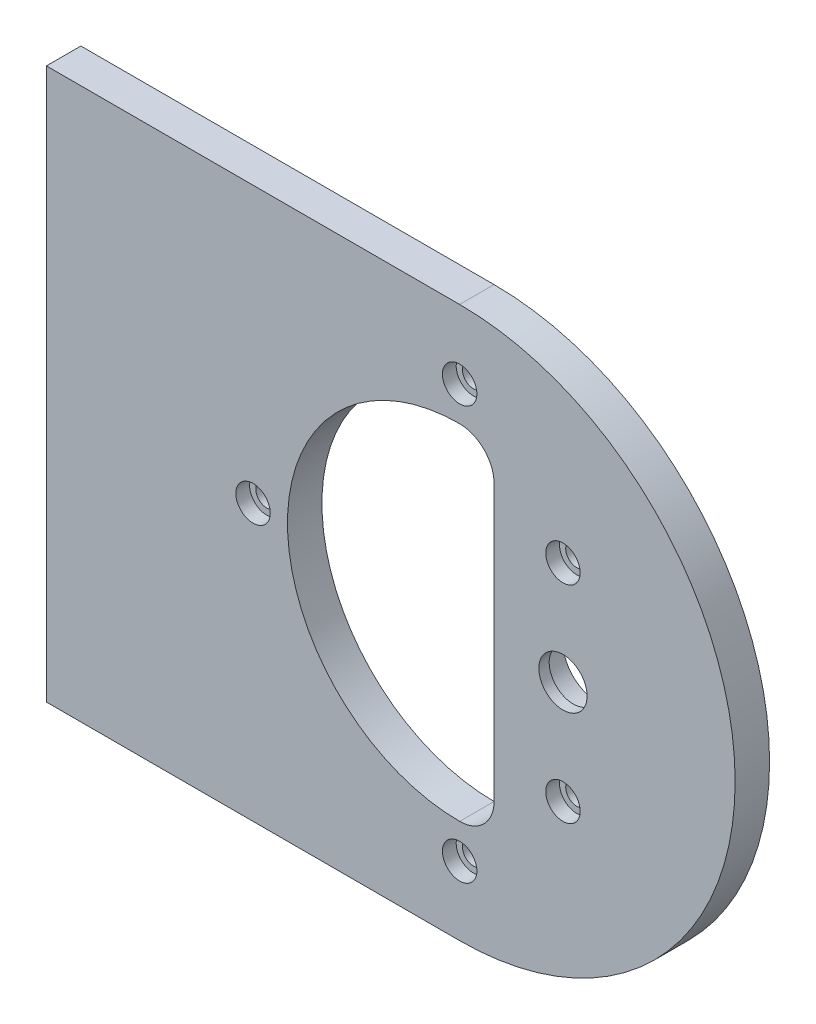
ISO-10303-21;
HEADER;
FILE_DESCRIPTION(('STEP AP214'),'2;1');
FILE_NAME('part.step','',(''),(''),'','','');
FILE_SCHEMA(('AUTOMOTIVE_DESIGN { 1 0 10303 214 1 1 1 1 }'));
ENDSEC;
DATA;
#1=APPLICATION_CONTEXT('core data for automotive mechanical design processes');
#2=APPLICATION_PROTOCOL_DEFINITION('international standard','automotive_design',2000,#1);
#3=PRODUCT_CONTEXT('',#1,'mechanical');
#4=PRODUCT('Part','Part','',(#3));
#5=PRODUCT_RELATED_PRODUCT_CATEGORY('part','',(#4));
#6=PRODUCT_DEFINITION_FORMATION('','',#4);
#7=PRODUCT_DEFINITION_CONTEXT('part definition',#1,'design');
#8=PRODUCT_DEFINITION('design','',#6,#7);
#9=PRODUCT_DEFINITION_SHAPE('','',#8);
#10=(LENGTH_UNIT() NAMED_UNIT(*) SI_UNIT(.MILLI.,.METRE.));
#11=(NAMED_UNIT(*) PLANE_ANGLE_UNIT() SI_UNIT($,.RADIAN.));
#12=(NAMED_UNIT(*) SI_UNIT($,.STERADIAN.) SOLID_ANGLE_UNIT());
#13=UNCERTAINTY_MEASURE_WITH_UNIT(LENGTH_MEASURE(1.E-05),#10,'distance_accuracy_value','');
#14=(GEOMETRIC_REPRESENTATION_CONTEXT(3) GLOBAL_UNCERTAINTY_ASSIGNED_CONTEXT((#13)) GLOBAL_UNIT_ASSIGNED_CONTEXT((#10,
#11,#12)) REPRESENTATION_CONTEXT('',''));
#15=CARTESIAN_POINT('',(0.,0.,0.));
#16=DIRECTION('',(0.,0.,1.));
#17=DIRECTION('',(1.,0.,0.));
#18=AXIS2_PLACEMENT_3D('',#15,#16,#17);
#19=CARTESIAN_POINT('',(6.45751311064591,-9.99999999999998,5.));
#20=DIRECTION('',(0.,1.,0.));
#21=DIRECTION('',(0.,0.,1.));
#22=AXIS2_PLACEMENT_3D('',#19,#20,#21);
#23=PLANE('',#22);
#24=DIRECTION('',(1.,0.,0.));
#25=VECTOR('',#24,1.);
#26=CARTESIAN_POINT('',(6.45751311064591,-9.99999999999998,0.));
#27=LINE('',#26,#25);
#28=CARTESIAN_POINT('',(6.45751311064591,-9.99999999999998,0.));
#29=VERTEX_POINT('',#28);
#30=CARTESIAN_POINT('',(66.4575131106459,-9.99999999999998,0.));
#31=VERTEX_POINT('',#30);
#32=EDGE_CURVE('E143',#29,#31,#27,.T.);
#33=ORIENTED_EDGE('',*,*,#32,.T.);
#34=DIRECTION('',(0.,0.,-1.));
#35=VECTOR('',#34,1.);
#36=CARTESIAN_POINT('',(66.4575131106459,-9.99999999999998,5.));
#37=LINE('',#36,#35);
#38=CARTESIAN_POINT('',(66.4575131106459,-9.99999999999998,5.));
#39=VERTEX_POINT('',#38);
#40=EDGE_CURVE('E11',#39,#31,#37,.T.);
#41=ORIENTED_EDGE('',*,*,#40,.F.);
#42=DIRECTION('',(1.,0.,0.));
#43=VECTOR('',#42,1.);
#44=CARTESIAN_POINT('',(6.45751311064591,-9.99999999999998,5.));
#45=LINE('',#44,#43);
#46=CARTESIAN_POINT('',(6.45751311064591,-9.99999999999998,5.));
#47=VERTEX_POINT('',#46);
#48=EDGE_CURVE('E144',#47,#39,#45,.T.);
#49=ORIENTED_EDGE('',*,*,#48,.F.);
#50=DIRECTION('',(0.,0.,-1.));
#51=VECTOR('',#50,1.);
#52=CARTESIAN_POINT('',(6.45751311064591,-9.99999999999998,5.));
#53=LINE('',#52,#51);
#54=EDGE_CURVE('E154',#47,#29,#53,.T.);
#55=ORIENTED_EDGE('',*,*,#54,.T.);
#56=EDGE_LOOP('',(#33,#41,#49,#55));
#57=FACE_BOUND('',#56,.T.);
#58=ADVANCED_FACE('F35',(#57),#23,.F.);
#59=CARTESIAN_POINT('',(66.4575131106459,30.,5.));
#60=DIRECTION('',(0.,0.,-1.));
#61=DIRECTION('',(-1.,0.,0.));
#62=AXIS2_PLACEMENT_3D('',#59,#60,#61);
#63=CYLINDRICAL_SURFACE('',#62,40.);
#64=CARTESIAN_POINT('',(66.4575131106459,30.,0.));
#65=DIRECTION('',(0.,0.,1.));
#66=DIRECTION('',(1.,0.,0.));
#67=AXIS2_PLACEMENT_3D('',#64,#65,#66);
#68=CIRCLE('',#67,40.);
#69=CARTESIAN_POINT('',(66.4575131106459,70.,0.));
#70=VERTEX_POINT('',#69);
#71=EDGE_CURVE('E157',#31,#70,#68,.T.);
#72=ORIENTED_EDGE('',*,*,#71,.T.);
#73=DIRECTION('',(0.,0.,-1.));
#74=VECTOR('',#73,1.);
#75=CARTESIAN_POINT('',(66.4575131106459,70.,5.));
#76=LINE('',#75,#74);
#77=CARTESIAN_POINT('',(66.4575131106459,70.,5.));
#78=VERTEX_POINT('',#77);
#79=EDGE_CURVE('E43',#78,#70,#76,.T.);
#80=ORIENTED_EDGE('',*,*,#79,.F.);
#81=CARTESIAN_POINT('',(66.4575131106459,30.,5.));
#82=DIRECTION('',(0.,0.,1.));
#83=DIRECTION('',(1.,0.,0.));
#84=AXIS2_PLACEMENT_3D('',#81,#82,#83);
#85=CIRCLE('',#84,40.);
#86=EDGE_CURVE('E147',#39,#78,#85,.T.);
#87=ORIENTED_EDGE('',*,*,#86,.F.);
#88=ORIENTED_EDGE('',*,*,#40,.T.);
#89=EDGE_LOOP('',(#72,#80,#87,#88));
#90=FACE_BOUND('',#89,.T.);
#91=ADVANCED_FACE('F186',(#90),#63,.T.);
#92=CARTESIAN_POINT('',(66.4575131106459,70.,5.));
#93=DIRECTION('',(0.,-1.,0.));
#94=DIRECTION('',(1.,0.,0.));
#95=AXIS2_PLACEMENT_3D('',#92,#93,#94);
#96=PLANE('',#95);
#97=DIRECTION('',(-1.,0.,0.));
#98=VECTOR('',#97,1.);
#99=CARTESIAN_POINT('',(66.4575131106459,70.,0.));
#100=LINE('',#99,#98);
#101=CARTESIAN_POINT('',(6.45751311064591,70.,0.));
#102=VERTEX_POINT('',#101);
#103=EDGE_CURVE('E159',#70,#102,#100,.T.);
#104=ORIENTED_EDGE('',*,*,#103,.T.);
#105=DIRECTION('',(0.,0.,-1.));
#106=VECTOR('',#105,1.);
#107=CARTESIAN_POINT('',(6.45751311064591,70.,5.));
#108=LINE('',#107,#106);
#109=CARTESIAN_POINT('',(6.45751311064591,70.,5.));
#110=VERTEX_POINT('',#109);
#111=EDGE_CURVE('E164',#110,#102,#108,.T.);
#112=ORIENTED_EDGE('',*,*,#111,.F.);
#113=DIRECTION('',(-1.,0.,0.));
#114=VECTOR('',#113,1.);
#115=CARTESIAN_POINT('',(66.4575131106459,70.,5.));
#116=LINE('',#115,#114);
#117=EDGE_CURVE('E150',#78,#110,#116,.T.);
#118=ORIENTED_EDGE('',*,*,#117,.F.);
#119=ORIENTED_EDGE('',*,*,#79,.T.);
#120=EDGE_LOOP('',(#104,#112,#118,#119));
#121=FACE_BOUND('',#120,.T.);
#122=ADVANCED_FACE('F172',(#121),#96,.F.);
#123=CARTESIAN_POINT('',(6.45751311064591,70.,5.));
#124=DIRECTION('',(1.,0.,0.));
#125=DIRECTION('',(0.,0.,-1.));
#126=AXIS2_PLACEMENT_3D('',#123,#124,#125);
#127=PLANE('',#126);
#128=DIRECTION('',(0.,-1.,0.));
#129=VECTOR('',#128,1.);
#130=CARTESIAN_POINT('',(6.45751311064591,70.,0.));
#131=LINE('',#130,#129);
#132=EDGE_CURVE('E148',#102,#29,#131,.T.);
#133=ORIENTED_EDGE('',*,*,#132,.T.);
#134=ORIENTED_EDGE('',*,*,#54,.F.);
#135=DIRECTION('',(0.,-1.,0.));
#136=VECTOR('',#135,1.);
#137=CARTESIAN_POINT('',(6.45751311064591,70.,5.));
#138=LINE('',#137,#136);
#139=EDGE_CURVE('E152',#110,#47,#138,.T.);
#140=ORIENTED_EDGE('',*,*,#139,.F.);
#141=ORIENTED_EDGE('',*,*,#111,.T.);
#142=EDGE_LOOP('',(#133,#134,#140,#141));
#143=FACE_BOUND('',#142,.T.);
#144=ADVANCED_FACE('F179',(#143),#127,.F.);
#145=CARTESIAN_POINT('',(66.4575131106459,30.,5.));
#146=DIRECTION('',(0.,0.,1.));
#147=DIRECTION('',(1.,0.,0.));
#148=AXIS2_PLACEMENT_3D('',#145,#146,#147);
#149=PLANE('',#148);
#150=CARTESIAN_POINT('',(81.4575131106459,30.,5.));
#151=DIRECTION('',(0.,0.,1.));
#152=DIRECTION('',(1.,0.,0.));
#153=AXIS2_PLACEMENT_3D('',#150,#151,#152);
#154=CIRCLE('',#153,3.50000000000001);
#155=CARTESIAN_POINT('',(84.9575131106459,30.,5.));
#156=VERTEX_POINT('',#155);
#157=EDGE_CURVE('E353',#156,#156,#154,.T.);
#158=ORIENTED_EDGE('',*,*,#157,.F.);
#159=EDGE_LOOP('',(#158));
#160=FACE_BOUND('',#159,.T.);
#161=CARTESIAN_POINT('',(66.4575131106465,0.,5.));
#162=DIRECTION('',(0.,0.,1.));
#163=DIRECTION('',(1.,0.,0.));
#164=AXIS2_PLACEMENT_3D('',#161,#162,#163);
#165=CIRCLE('',#164,2.50000000000001);
#166=CARTESIAN_POINT('',(68.9575131106465,0.,5.));
#167=VERTEX_POINT('',#166);
#168=EDGE_CURVE('E393',#167,#167,#165,.T.);
#169=ORIENTED_EDGE('',*,*,#168,.F.);
#170=EDGE_LOOP('',(#169));
#171=FACE_BOUND('',#170,.T.);
#172=CARTESIAN_POINT('',(36.4575131106463,29.9999999999999,5.));
#173=DIRECTION('',(0.,0.,1.));
#174=DIRECTION('',(1.,0.,0.));
#175=AXIS2_PLACEMENT_3D('',#172,#173,#174);
#176=CIRCLE('',#175,2.5);
#177=CARTESIAN_POINT('',(38.9575131106463,29.9999999999999,5.));
#178=VERTEX_POINT('',#177);
#179=EDGE_CURVE('E399',#178,#178,#176,.T.);
#180=ORIENTED_EDGE('',*,*,#179,.F.);
#181=EDGE_LOOP('',(#180));
#182=FACE_BOUND('',#181,.T.);
#183=CARTESIAN_POINT('',(81.4575131106459,45.,5.));
#184=DIRECTION('',(0.,0.,1.));
#185=DIRECTION('',(1.,0.,0.));
#186=AXIS2_PLACEMENT_3D('',#183,#184,#185);
#187=CIRCLE('',#186,2.50000000000001);
#188=CARTESIAN_POINT('',(83.9575131106459,45.,5.));
#189=VERTEX_POINT('',#188);
#190=EDGE_CURVE('E405',#189,#189,#187,.T.);
#191=ORIENTED_EDGE('',*,*,#190,.F.);
#192=EDGE_LOOP('',(#191));
#193=FACE_BOUND('',#192,.T.);
#194=CARTESIAN_POINT('',(81.4575131106459,15.,5.));
#195=DIRECTION('',(0.,0.,1.));
#196=DIRECTION('',(1.,0.,0.));
#197=AXIS2_PLACEMENT_3D('',#194,#195,#196);
#198=CIRCLE('',#197,2.50000000000001);
#199=CARTESIAN_POINT('',(83.9575131106459,15.,5.));
#200=VERTEX_POINT('',#199);
#201=EDGE_CURVE('E386',#200,#200,#198,.T.);
#202=ORIENTED_EDGE('',*,*,#201,.F.);
#203=EDGE_LOOP('',(#202));
#204=FACE_BOUND('',#203,.T.);
#205=CARTESIAN_POINT('',(66.4575131106459,60.,5.));
#206=DIRECTION('',(0.,0.,1.));
#207=DIRECTION('',(1.,0.,0.));
#208=AXIS2_PLACEMENT_3D('',#205,#206,#207);
#209=CIRCLE('',#208,2.50000000000001);
#210=CARTESIAN_POINT('',(68.9575131106459,60.,5.));
#211=VERTEX_POINT('',#210);
#212=EDGE_CURVE('E392',#211,#211,#209,.T.);
#213=ORIENTED_EDGE('',*,*,#212,.F.);
#214=EDGE_LOOP('',(#213));
#215=FACE_BOUND('',#214,.T.);
#216=CARTESIAN_POINT('',(66.4575131106459,10.,5.));
#217=DIRECTION('',(0.,0.,1.));
#218=DIRECTION('',(1.,0.,0.));
#219=AXIS2_PLACEMENT_3D('',#216,#217,#218);
#220=CIRCLE('',#219,5.);
#221=CARTESIAN_POINT('',(71.4575131106459,10.,5.));
#222=VERTEX_POINT('',#221);
#223=CARTESIAN_POINT('',(66.4575131106459,4.99999999999999,5.));
#224=VERTEX_POINT('',#223);
#225=EDGE_CURVE('E140',#222,#224,#220,.F.);
#226=ORIENTED_EDGE('',*,*,#225,.T.);
#227=CARTESIAN_POINT('',(66.4575131106459,30.,5.));
#228=DIRECTION('',(0.,0.,1.));
#229=DIRECTION('',(1.,0.,0.));
#230=AXIS2_PLACEMENT_3D('',#227,#228,#229);
#231=CIRCLE('',#230,25.);
#232=CARTESIAN_POINT('',(66.4575131106459,55.,5.));
#233=VERTEX_POINT('',#232);
#234=EDGE_CURVE('E103',#224,#233,#231,.F.);
#235=ORIENTED_EDGE('',*,*,#234,.T.);
#236=CARTESIAN_POINT('',(66.4575131106459,50.,5.));
#237=DIRECTION('',(0.,0.,1.));
#238=DIRECTION('',(1.,0.,0.));
#239=AXIS2_PLACEMENT_3D('',#236,#237,#238);
#240=CIRCLE('',#239,5.);
#241=CARTESIAN_POINT('',(71.4575131106459,50.,5.));
#242=VERTEX_POINT('',#241);
#243=EDGE_CURVE('E106',#233,#242,#240,.F.);
#244=ORIENTED_EDGE('',*,*,#243,.T.);
#245=DIRECTION('',(0.,-1.,0.));
#246=VECTOR('',#245,1.);
#247=CARTESIAN_POINT('',(71.4575131106459,30.,5.));
#248=LINE('',#247,#246);
#249=EDGE_CURVE('E137',#242,#222,#248,.T.);
#250=ORIENTED_EDGE('',*,*,#249,.T.);
#251=EDGE_LOOP('',(#226,#235,#244,#250));
#252=FACE_BOUND('',#251,.T.);
#253=ORIENTED_EDGE('',*,*,#48,.T.);
#254=ORIENTED_EDGE('',*,*,#86,.T.);
#255=ORIENTED_EDGE('',*,*,#117,.T.);
#256=ORIENTED_EDGE('',*,*,#139,.T.);
#257=EDGE_LOOP('',(#253,#254,#255,#256));
#258=FACE_BOUND('',#257,.T.);
#259=ADVANCED_FACE('F185',(#160,#171,#182,#193,#204,#215,#252,#258),#149,.T.);
#260=CARTESIAN_POINT('',(66.4575131106459,30.,0.));
#261=DIRECTION('',(0.,0.,1.));
#262=DIRECTION('',(1.,0.,0.));
#263=AXIS2_PLACEMENT_3D('',#260,#261,#262);
#264=PLANE('',#263);
#265=CARTESIAN_POINT('',(81.4575131106459,45.,0.));
#266=DIRECTION('',(0.,0.,1.));
#267=DIRECTION('',(1.,0.,0.));
#268=AXIS2_PLACEMENT_3D('',#265,#266,#267);
#269=CIRCLE('',#268,1.60000000000001);
#270=CARTESIAN_POINT('',(83.0575131106459,45.,0.));
#271=VERTEX_POINT('',#270);
#272=EDGE_CURVE('E366',#271,#271,#269,.T.);
#273=ORIENTED_EDGE('',*,*,#272,.T.);
#274=EDGE_LOOP('',(#273));
#275=FACE_BOUND('',#274,.T.);
#276=CARTESIAN_POINT('',(81.4575131106459,15.,0.));
#277=DIRECTION('',(0.,0.,1.));
#278=DIRECTION('',(1.,0.,0.));
#279=AXIS2_PLACEMENT_3D('',#276,#277,#278);
#280=CIRCLE('',#279,1.6);
#281=CARTESIAN_POINT('',(83.0575131106459,15.,0.));
#282=VERTEX_POINT('',#281);
#283=EDGE_CURVE('E372',#282,#282,#280,.T.);
#284=ORIENTED_EDGE('',*,*,#283,.T.);
#285=EDGE_LOOP('',(#284));
#286=FACE_BOUND('',#285,.T.);
#287=CARTESIAN_POINT('',(66.4575131106465,0.,0.));
#288=DIRECTION('',(0.,0.,1.));
#289=DIRECTION('',(1.,0.,0.));
#290=AXIS2_PLACEMENT_3D('',#287,#288,#289);
#291=CIRCLE('',#290,1.60000000000001);
#292=CARTESIAN_POINT('',(68.0575131106466,0.,0.));
#293=VERTEX_POINT('',#292);
#294=EDGE_CURVE('E378',#293,#293,#291,.T.);
#295=ORIENTED_EDGE('',*,*,#294,.T.);
#296=EDGE_LOOP('',(#295));
#297=FACE_BOUND('',#296,.T.);
#298=CARTESIAN_POINT('',(36.4575131106463,29.9999999999999,0.));
#299=DIRECTION('',(0.,0.,1.));
#300=DIRECTION('',(1.,0.,0.));
#301=AXIS2_PLACEMENT_3D('',#298,#299,#300);
#302=CIRCLE('',#301,1.6);
#303=CARTESIAN_POINT('',(38.0575131106463,29.9999999999999,0.));
#304=VERTEX_POINT('',#303);
#305=EDGE_CURVE('E356',#304,#304,#302,.T.);
#306=ORIENTED_EDGE('',*,*,#305,.T.);
#307=EDGE_LOOP('',(#306));
#308=FACE_BOUND('',#307,.T.);
#309=CARTESIAN_POINT('',(66.4575131106459,60.,0.));
#310=DIRECTION('',(0.,0.,1.));
#311=DIRECTION('',(1.,0.,0.));
#312=AXIS2_PLACEMENT_3D('',#309,#310,#311);
#313=CIRCLE('',#312,1.60000000000001);
#314=CARTESIAN_POINT('',(68.0575131106459,60.,0.));
#315=VERTEX_POINT('',#314);
#316=EDGE_CURVE('E365',#315,#315,#313,.T.);
#317=ORIENTED_EDGE('',*,*,#316,.T.);
#318=EDGE_LOOP('',(#317));
#319=FACE_BOUND('',#318,.T.);
#320=CARTESIAN_POINT('',(92.974017405142,56.5165042944966,0.));
#321=DIRECTION('',(0.,0.,1.));
#322=DIRECTION('',(1.,0.,0.));
#323=AXIS2_PLACEMENT_3D('',#320,#321,#322);
#324=CIRCLE('',#323,0.999999999999998);
#325=CARTESIAN_POINT('',(93.974017405142,56.5165042944966,0.));
#326=VERTEX_POINT('',#325);
#327=EDGE_CURVE('E423',#326,#326,#324,.T.);
#328=ORIENTED_EDGE('',*,*,#327,.T.);
#329=EDGE_LOOP('',(#328));
#330=FACE_BOUND('',#329,.T.);
#331=CARTESIAN_POINT('',(103.957513110647,30.0000000000015,0.));
#332=DIRECTION('',(0.,0.,1.));
#333=DIRECTION('',(1.,0.,0.));
#334=AXIS2_PLACEMENT_3D('',#331,#332,#333);
#335=CIRCLE('',#334,0.999999999999998);
#336=CARTESIAN_POINT('',(104.957513110647,30.0000000000015,0.));
#337=VERTEX_POINT('',#336);
#338=EDGE_CURVE('E429',#337,#337,#335,.T.);
#339=ORIENTED_EDGE('',*,*,#338,.T.);
#340=EDGE_LOOP('',(#339));
#341=FACE_BOUND('',#340,.T.);
#342=CARTESIAN_POINT('',(92.974017405144,3.48349570550546,0.));
#343=DIRECTION('',(0.,0.,1.));
#344=DIRECTION('',(1.,0.,0.));
#345=AXIS2_PLACEMENT_3D('',#342,#343,#344);
#346=CIRCLE('',#345,1.);
#347=CARTESIAN_POINT('',(93.974017405144,3.48349570550546,0.));
#348=VERTEX_POINT('',#347);
#349=EDGE_CURVE('E435',#348,#348,#346,.T.);
#350=ORIENTED_EDGE('',*,*,#349,.T.);
#351=EDGE_LOOP('',(#350));
#352=FACE_BOUND('',#351,.T.);
#353=CARTESIAN_POINT('',(66.4575131106488,-7.50000000000003,0.));
#354=DIRECTION('',(0.,0.,1.));
#355=DIRECTION('',(1.,0.,0.));
#356=AXIS2_PLACEMENT_3D('',#353,#354,#355);
#357=CIRCLE('',#356,0.999999999999994);
#358=CARTESIAN_POINT('',(67.4575131106488,-7.50000000000003,0.));
#359=VERTEX_POINT('',#358);
#360=EDGE_CURVE('E441',#359,#359,#357,.T.);
#361=ORIENTED_EDGE('',*,*,#360,.T.);
#362=EDGE_LOOP('',(#361));
#363=FACE_BOUND('',#362,.T.);
#364=CARTESIAN_POINT('',(39.9410088161529,3.48349570550356,0.));
#365=DIRECTION('',(0.,0.,1.));
#366=DIRECTION('',(1.,0.,0.));
#367=AXIS2_PLACEMENT_3D('',#364,#365,#366);
#368=CIRCLE('',#367,0.999999999999998);
#369=CARTESIAN_POINT('',(40.9410088161529,3.48349570550356,0.));
#370=VERTEX_POINT('',#369);
#371=EDGE_CURVE('E447',#370,#370,#368,.T.);
#372=ORIENTED_EDGE('',*,*,#371,.T.);
#373=EDGE_LOOP('',(#372));
#374=FACE_BOUND('',#373,.T.);
#375=CARTESIAN_POINT('',(28.9575131106475,29.9999999999988,0.));
#376=DIRECTION('',(0.,0.,1.));
#377=DIRECTION('',(1.,0.,0.));
#378=AXIS2_PLACEMENT_3D('',#375,#376,#377);
#379=CIRCLE('',#378,0.999999999999994);
#380=CARTESIAN_POINT('',(29.9575131106475,29.9999999999988,0.));
#381=VERTEX_POINT('',#380);
#382=EDGE_CURVE('E453',#381,#381,#379,.T.);
#383=ORIENTED_EDGE('',*,*,#382,.T.);
#384=EDGE_LOOP('',(#383));
#385=FACE_BOUND('',#384,.T.);
#386=CARTESIAN_POINT('',(39.9410088161512,56.5165042944947,0.));
#387=DIRECTION('',(0.,0.,1.));
#388=DIRECTION('',(1.,0.,0.));
#389=AXIS2_PLACEMENT_3D('',#386,#387,#388);
#390=CIRCLE('',#389,1.);
#391=CARTESIAN_POINT('',(40.9410088161512,56.5165042944947,0.));
#392=VERTEX_POINT('',#391);
#393=EDGE_CURVE('E416',#392,#392,#390,.T.);
#394=ORIENTED_EDGE('',*,*,#393,.T.);
#395=EDGE_LOOP('',(#394));
#396=FACE_BOUND('',#395,.T.);
#397=CARTESIAN_POINT('',(66.4575131106459,67.5,0.));
#398=DIRECTION('',(0.,0.,1.));
#399=DIRECTION('',(1.,0.,0.));
#400=AXIS2_PLACEMENT_3D('',#397,#398,#399);
#401=CIRCLE('',#400,0.999999999999998);
#402=CARTESIAN_POINT('',(67.4575131106459,67.5,0.));
#403=VERTEX_POINT('',#402);
#404=EDGE_CURVE('E422',#403,#403,#401,.T.);
#405=ORIENTED_EDGE('',*,*,#404,.T.);
#406=EDGE_LOOP('',(#405));
#407=FACE_BOUND('',#406,.T.);
#408=CARTESIAN_POINT('',(81.4575131106459,30.,0.));
#409=DIRECTION('',(0.,0.,1.));
#410=DIRECTION('',(1.,0.,0.));
#411=AXIS2_PLACEMENT_3D('',#408,#409,#410);
#412=CIRCLE('',#411,5.00000000000001);
#413=CARTESIAN_POINT('',(86.4575131106459,30.,0.));
#414=VERTEX_POINT('',#413);
#415=EDGE_CURVE('E125',#414,#414,#412,.T.);
#416=ORIENTED_EDGE('',*,*,#415,.T.);
#417=EDGE_LOOP('',(#416));
#418=FACE_BOUND('',#417,.T.);
#419=CARTESIAN_POINT('',(66.4575131106459,30.,0.));
#420=DIRECTION('',(0.,0.,1.));
#421=DIRECTION('',(1.,0.,0.));
#422=AXIS2_PLACEMENT_3D('',#419,#420,#421);
#423=CIRCLE('',#422,25.);
#424=CARTESIAN_POINT('',(66.4575131106459,55.,0.));
#425=VERTEX_POINT('',#424);
#426=CARTESIAN_POINT('',(66.4575131106459,4.99999999999999,0.));
#427=VERTEX_POINT('',#426);
#428=EDGE_CURVE('E58',#425,#427,#423,.T.);
#429=ORIENTED_EDGE('',*,*,#428,.T.);
#430=CARTESIAN_POINT('',(66.4575131106459,10.,0.));
#431=DIRECTION('',(0.,0.,1.));
#432=DIRECTION('',(1.,0.,0.));
#433=AXIS2_PLACEMENT_3D('',#430,#431,#432);
#434=CIRCLE('',#433,5.);
#435=CARTESIAN_POINT('',(71.4575131106459,10.,0.));
#436=VERTEX_POINT('',#435);
#437=EDGE_CURVE('E110',#427,#436,#434,.T.);
#438=ORIENTED_EDGE('',*,*,#437,.T.);
#439=DIRECTION('',(0.,1.,0.));
#440=VECTOR('',#439,1.);
#441=CARTESIAN_POINT('',(71.4575131106459,35.,0.));
#442=LINE('',#441,#440);
#443=CARTESIAN_POINT('',(71.4575131106459,50.,0.));
#444=VERTEX_POINT('',#443);
#445=EDGE_CURVE('E116',#436,#444,#442,.T.);
#446=ORIENTED_EDGE('',*,*,#445,.T.);
#447=CARTESIAN_POINT('',(66.4575131106459,50.,0.));
#448=DIRECTION('',(0.,0.,1.));
#449=DIRECTION('',(1.,0.,0.));
#450=AXIS2_PLACEMENT_3D('',#447,#448,#449);
#451=CIRCLE('',#450,5.);
#452=EDGE_CURVE('E121',#444,#425,#451,.T.);
#453=ORIENTED_EDGE('',*,*,#452,.T.);
#454=EDGE_LOOP('',(#429,#438,#446,#453));
#455=FACE_BOUND('',#454,.T.);
#456=ORIENTED_EDGE('',*,*,#32,.F.);
#457=ORIENTED_EDGE('',*,*,#132,.F.);
#458=ORIENTED_EDGE('',*,*,#103,.F.);
#459=ORIENTED_EDGE('',*,*,#71,.F.);
#460=EDGE_LOOP('',(#456,#457,#458,#459));
#461=FACE_BOUND('',#460,.T.);
#462=ADVANCED_FACE('F119',(#275,#286,#297,#308,#319,#330,#341,#352,#363,#374,#385,#396,#407,
#418,#455,#461),#264,.F.);
#463=CARTESIAN_POINT('',(66.4575131106459,30.,10.));
#464=DIRECTION('',(0.,0.,-1.));
#465=DIRECTION('',(-1.,0.,0.));
#466=AXIS2_PLACEMENT_3D('',#463,#464,#465);
#467=CYLINDRICAL_SURFACE('',#466,25.);
#468=DIRECTION('',(0.,0.,-1.));
#469=VECTOR('',#468,1.);
#470=CARTESIAN_POINT('',(66.4575131106459,4.99999999999999,10.));
#471=LINE('',#470,#469);
#472=EDGE_CURVE('E99',#224,#427,#471,.T.);
#473=ORIENTED_EDGE('',*,*,#472,.T.);
#474=ORIENTED_EDGE('',*,*,#428,.F.);
#475=DIRECTION('',(0.,0.,-1.));
#476=VECTOR('',#475,1.);
#477=CARTESIAN_POINT('',(66.4575131106459,55.,10.));
#478=LINE('',#477,#476);
#479=EDGE_CURVE('E131',#233,#425,#478,.T.);
#480=ORIENTED_EDGE('',*,*,#479,.F.);
#481=ORIENTED_EDGE('',*,*,#234,.F.);
#482=EDGE_LOOP('',(#473,#474,#480,#481));
#483=FACE_BOUND('',#482,.T.);
#484=ADVANCED_FACE('F101',(#483),#467,.F.);
#485=CARTESIAN_POINT('',(66.4575131106459,10.,10.));
#486=DIRECTION('',(0.,0.,-1.));
#487=DIRECTION('',(-1.,0.,0.));
#488=AXIS2_PLACEMENT_3D('',#485,#486,#487);
#489=CYLINDRICAL_SURFACE('',#488,5.);
#490=DIRECTION('',(0.,0.,-1.));
#491=VECTOR('',#490,1.);
#492=CARTESIAN_POINT('',(71.4575131106459,10.,10.));
#493=LINE('',#492,#491);
#494=EDGE_CURVE('E107',#222,#436,#493,.T.);
#495=ORIENTED_EDGE('',*,*,#494,.T.);
#496=ORIENTED_EDGE('',*,*,#437,.F.);
#497=ORIENTED_EDGE('',*,*,#472,.F.);
#498=ORIENTED_EDGE('',*,*,#225,.F.);
#499=EDGE_LOOP('',(#495,#496,#497,#498));
#500=FACE_BOUND('',#499,.T.);
#501=ADVANCED_FACE('F111',(#500),#489,.F.);
#502=CARTESIAN_POINT('',(71.4575131106459,35.,10.));
#503=DIRECTION('',(-1.,0.,0.));
#504=DIRECTION('',(0.,0.,1.));
#505=AXIS2_PLACEMENT_3D('',#502,#503,#504);
#506=PLANE('',#505);
#507=DIRECTION('',(0.,0.,-1.));
#508=VECTOR('',#507,1.);
#509=CARTESIAN_POINT('',(71.4575131106459,50.,10.));
#510=LINE('',#509,#508);
#511=EDGE_CURVE('E50',#242,#444,#510,.T.);
#512=ORIENTED_EDGE('',*,*,#511,.T.);
#513=ORIENTED_EDGE('',*,*,#445,.F.);
#514=ORIENTED_EDGE('',*,*,#494,.F.);
#515=ORIENTED_EDGE('',*,*,#249,.F.);
#516=EDGE_LOOP('',(#512,#513,#514,#515));
#517=FACE_BOUND('',#516,.T.);
#518=ADVANCED_FACE('F206',(#517),#506,.T.);
#519=CARTESIAN_POINT('',(66.4575131106459,50.,10.));
#520=DIRECTION('',(0.,0.,-1.));
#521=DIRECTION('',(-1.,0.,0.));
#522=AXIS2_PLACEMENT_3D('',#519,#520,#521);
#523=CYLINDRICAL_SURFACE('',#522,5.);
#524=ORIENTED_EDGE('',*,*,#479,.T.);
#525=ORIENTED_EDGE('',*,*,#452,.F.);
#526=ORIENTED_EDGE('',*,*,#511,.F.);
#527=ORIENTED_EDGE('',*,*,#243,.F.);
#528=EDGE_LOOP('',(#524,#525,#526,#527));
#529=FACE_BOUND('',#528,.T.);
#530=ADVANCED_FACE('F209',(#529),#523,.F.);
#531=CARTESIAN_POINT('',(81.4575131106459,30.,3.5));
#532=DIRECTION('',(0.,0.,-1.));
#533=DIRECTION('',(-1.,0.,0.));
#534=AXIS2_PLACEMENT_3D('',#531,#532,#533);
#535=CYLINDRICAL_SURFACE('',#534,5.00000000000001);
#536=CARTESIAN_POINT('',(81.4575131106459,30.,3.5));
#537=DIRECTION('',(0.,0.,1.));
#538=DIRECTION('',(1.,0.,0.));
#539=AXIS2_PLACEMENT_3D('',#536,#537,#538);
#540=CIRCLE('',#539,5.00000000000001);
#541=CARTESIAN_POINT('',(86.4575131106459,30.,3.5));
#542=VERTEX_POINT('',#541);
#543=EDGE_CURVE('E122',#542,#542,#540,.T.);
#544=ORIENTED_EDGE('',*,*,#543,.T.);
#545=EDGE_LOOP('',(#544));
#546=FACE_BOUND('',#545,.T.);
#547=ORIENTED_EDGE('',*,*,#415,.F.);
#548=EDGE_LOOP('',(#547));
#549=FACE_BOUND('',#548,.T.);
#550=ADVANCED_FACE('F213',(#546,#549),#535,.F.);
#551=CARTESIAN_POINT('',(81.4575131106459,30.,3.5));
#552=DIRECTION('',(0.,0.,1.));
#553=DIRECTION('',(1.,0.,0.));
#554=AXIS2_PLACEMENT_3D('',#551,#552,#553);
#555=PLANE('',#554);
#556=CARTESIAN_POINT('',(81.4575131106459,30.,3.5));
#557=DIRECTION('',(0.,0.,1.));
#558=DIRECTION('',(1.,0.,0.));
#559=AXIS2_PLACEMENT_3D('',#556,#557,#558);
#560=CIRCLE('',#559,3.50000000000001);
#561=CARTESIAN_POINT('',(84.9575131106459,30.,3.5));
#562=VERTEX_POINT('',#561);
#563=EDGE_CURVE('E38',#562,#562,#560,.T.);
#564=ORIENTED_EDGE('',*,*,#563,.T.);
#565=EDGE_LOOP('',(#564));
#566=FACE_BOUND('',#565,.T.);
#567=ORIENTED_EDGE('',*,*,#543,.F.);
#568=EDGE_LOOP('',(#567));
#569=FACE_BOUND('',#568,.T.);
#570=ADVANCED_FACE('F216',(#566,#569),#555,.F.);
#571=CARTESIAN_POINT('',(66.4575131106459,67.5,1.));
#572=DIRECTION('',(0.,0.,-1.));
#573=DIRECTION('',(-1.,0.,0.));
#574=AXIS2_PLACEMENT_3D('',#571,#572,#573);
#575=CYLINDRICAL_SURFACE('',#574,0.999999999999998);
#576=CARTESIAN_POINT('',(66.4575131106459,67.5,1.));
#577=DIRECTION('',(0.,0.,1.));
#578=DIRECTION('',(1.,0.,0.));
#579=AXIS2_PLACEMENT_3D('',#576,#577,#578);
#580=CIRCLE('',#579,0.999999999999998);
#581=CARTESIAN_POINT('',(67.4575131106459,67.5,1.));
#582=VERTEX_POINT('',#581);
#583=EDGE_CURVE('E461',#582,#582,#580,.T.);
#584=ORIENTED_EDGE('',*,*,#583,.T.);
#585=EDGE_LOOP('',(#584));
#586=FACE_BOUND('',#585,.T.);
#587=ORIENTED_EDGE('',*,*,#404,.F.);
#588=EDGE_LOOP('',(#587));
#589=FACE_BOUND('',#588,.T.);
#590=ADVANCED_FACE('F220',(#586,#589),#575,.F.);
#591=CARTESIAN_POINT('',(66.4575131106459,67.5,1.));
#592=DIRECTION('',(0.,0.,1.));
#593=DIRECTION('',(1.,0.,0.));
#594=AXIS2_PLACEMENT_3D('',#591,#592,#593);
#595=PLANE('',#594);
#596=ORIENTED_EDGE('',*,*,#583,.F.);
#597=EDGE_LOOP('',(#596));
#598=FACE_BOUND('',#597,.T.);
#599=ADVANCED_FACE('F224',(#598),#595,.F.);
#600=CARTESIAN_POINT('',(39.9410088161512,56.5165042944947,1.));
#601=DIRECTION('',(0.,0.,-1.));
#602=DIRECTION('',(-1.,0.,0.));
#603=AXIS2_PLACEMENT_3D('',#600,#601,#602);
#604=CYLINDRICAL_SURFACE('',#603,1.);
#605=CARTESIAN_POINT('',(39.9410088161512,56.5165042944947,1.));
#606=DIRECTION('',(0.,0.,1.));
#607=DIRECTION('',(1.,0.,0.));
#608=AXIS2_PLACEMENT_3D('',#605,#606,#607);
#609=CIRCLE('',#608,1.);
#610=CARTESIAN_POINT('',(40.9410088161512,56.5165042944947,1.));
#611=VERTEX_POINT('',#610);
#612=EDGE_CURVE('E456',#611,#611,#609,.T.);
#613=ORIENTED_EDGE('',*,*,#612,.T.);
#614=EDGE_LOOP('',(#613));
#615=FACE_BOUND('',#614,.T.);
#616=ORIENTED_EDGE('',*,*,#393,.F.);
#617=EDGE_LOOP('',(#616));
#618=FACE_BOUND('',#617,.T.);
#619=ADVANCED_FACE('F228',(#615,#618),#604,.F.);
#620=CARTESIAN_POINT('',(39.9410088161512,56.5165042944947,1.));
#621=DIRECTION('',(0.,0.,1.));
#622=DIRECTION('',(1.,0.,0.));
#623=AXIS2_PLACEMENT_3D('',#620,#621,#622);
#624=PLANE('',#623);
#625=ORIENTED_EDGE('',*,*,#612,.F.);
#626=EDGE_LOOP('',(#625));
#627=FACE_BOUND('',#626,.T.);
#628=ADVANCED_FACE('F232',(#627),#624,.F.);
#629=CARTESIAN_POINT('',(28.9575131106475,29.9999999999988,1.));
#630=DIRECTION('',(0.,0.,-1.));
#631=DIRECTION('',(-1.,0.,0.));
#632=AXIS2_PLACEMENT_3D('',#629,#630,#631);
#633=CYLINDRICAL_SURFACE('',#632,0.999999999999994);
#634=CARTESIAN_POINT('',(28.9575131106475,29.9999999999988,1.));
#635=DIRECTION('',(0.,0.,1.));
#636=DIRECTION('',(1.,0.,0.));
#637=AXIS2_PLACEMENT_3D('',#634,#635,#636);
#638=CIRCLE('',#637,0.999999999999994);
#639=CARTESIAN_POINT('',(29.9575131106475,29.9999999999988,1.));
#640=VERTEX_POINT('',#639);
#641=EDGE_CURVE('E450',#640,#640,#638,.T.);
#642=ORIENTED_EDGE('',*,*,#641,.T.);
#643=EDGE_LOOP('',(#642));
#644=FACE_BOUND('',#643,.T.);
#645=ORIENTED_EDGE('',*,*,#382,.F.);
#646=EDGE_LOOP('',(#645));
#647=FACE_BOUND('',#646,.T.);
#648=ADVANCED_FACE('F236',(#644,#647),#633,.F.);
#649=CARTESIAN_POINT('',(28.9575131106475,29.9999999999988,1.));
#650=DIRECTION('',(0.,0.,1.));
#651=DIRECTION('',(1.,0.,0.));
#652=AXIS2_PLACEMENT_3D('',#649,#650,#651);
#653=PLANE('',#652);
#654=ORIENTED_EDGE('',*,*,#641,.F.);
#655=EDGE_LOOP('',(#654));
#656=FACE_BOUND('',#655,.T.);
#657=ADVANCED_FACE('F240',(#656),#653,.F.);
#658=CARTESIAN_POINT('',(39.9410088161529,3.48349570550356,1.));
#659=DIRECTION('',(0.,0.,-1.));
#660=DIRECTION('',(-1.,0.,0.));
#661=AXIS2_PLACEMENT_3D('',#658,#659,#660);
#662=CYLINDRICAL_SURFACE('',#661,0.999999999999998);
#663=CARTESIAN_POINT('',(39.9410088161529,3.48349570550356,1.));
#664=DIRECTION('',(0.,0.,1.));
#665=DIRECTION('',(1.,0.,0.));
#666=AXIS2_PLACEMENT_3D('',#663,#664,#665);
#667=CIRCLE('',#666,0.999999999999998);
#668=CARTESIAN_POINT('',(40.9410088161529,3.48349570550356,1.));
#669=VERTEX_POINT('',#668);
#670=EDGE_CURVE('E444',#669,#669,#667,.T.);
#671=ORIENTED_EDGE('',*,*,#670,.T.);
#672=EDGE_LOOP('',(#671));
#673=FACE_BOUND('',#672,.T.);
#674=ORIENTED_EDGE('',*,*,#371,.F.);
#675=EDGE_LOOP('',(#674));
#676=FACE_BOUND('',#675,.T.);
#677=ADVANCED_FACE('F244',(#673,#676),#662,.F.);
#678=CARTESIAN_POINT('',(39.9410088161529,3.48349570550356,1.));
#679=DIRECTION('',(0.,0.,1.));
#680=DIRECTION('',(1.,0.,0.));
#681=AXIS2_PLACEMENT_3D('',#678,#679,#680);
#682=PLANE('',#681);
#683=ORIENTED_EDGE('',*,*,#670,.F.);
#684=EDGE_LOOP('',(#683));
#685=FACE_BOUND('',#684,.T.);
#686=ADVANCED_FACE('F248',(#685),#682,.F.);
#687=CARTESIAN_POINT('',(66.4575131106488,-7.50000000000003,1.));
#688=DIRECTION('',(0.,0.,-1.));
#689=DIRECTION('',(-1.,0.,0.));
#690=AXIS2_PLACEMENT_3D('',#687,#688,#689);
#691=CYLINDRICAL_SURFACE('',#690,0.999999999999994);
#692=CARTESIAN_POINT('',(66.4575131106488,-7.50000000000003,1.));
#693=DIRECTION('',(0.,0.,1.));
#694=DIRECTION('',(1.,0.,0.));
#695=AXIS2_PLACEMENT_3D('',#692,#693,#694);
#696=CIRCLE('',#695,0.999999999999994);
#697=CARTESIAN_POINT('',(67.4575131106488,-7.50000000000003,1.));
#698=VERTEX_POINT('',#697);
#699=EDGE_CURVE('E438',#698,#698,#696,.T.);
#700=ORIENTED_EDGE('',*,*,#699,.T.);
#701=EDGE_LOOP('',(#700));
#702=FACE_BOUND('',#701,.T.);
#703=ORIENTED_EDGE('',*,*,#360,.F.);
#704=EDGE_LOOP('',(#703));
#705=FACE_BOUND('',#704,.T.);
#706=ADVANCED_FACE('F252',(#702,#705),#691,.F.);
#707=CARTESIAN_POINT('',(66.4575131106488,-7.50000000000003,1.));
#708=DIRECTION('',(0.,0.,1.));
#709=DIRECTION('',(1.,0.,0.));
#710=AXIS2_PLACEMENT_3D('',#707,#708,#709);
#711=PLANE('',#710);
#712=ORIENTED_EDGE('',*,*,#699,.F.);
#713=EDGE_LOOP('',(#712));
#714=FACE_BOUND('',#713,.T.);
#715=ADVANCED_FACE('F256',(#714),#711,.F.);
#716=CARTESIAN_POINT('',(92.974017405144,3.48349570550546,1.));
#717=DIRECTION('',(0.,0.,-1.));
#718=DIRECTION('',(-1.,0.,0.));
#719=AXIS2_PLACEMENT_3D('',#716,#717,#718);
#720=CYLINDRICAL_SURFACE('',#719,1.);
#721=CARTESIAN_POINT('',(92.974017405144,3.48349570550546,1.));
#722=DIRECTION('',(0.,0.,1.));
#723=DIRECTION('',(1.,0.,0.));
#724=AXIS2_PLACEMENT_3D('',#721,#722,#723);
#725=CIRCLE('',#724,1.);
#726=CARTESIAN_POINT('',(93.974017405144,3.48349570550546,1.));
#727=VERTEX_POINT('',#726);
#728=EDGE_CURVE('E432',#727,#727,#725,.T.);
#729=ORIENTED_EDGE('',*,*,#728,.T.);
#730=EDGE_LOOP('',(#729));
#731=FACE_BOUND('',#730,.T.);
#732=ORIENTED_EDGE('',*,*,#349,.F.);
#733=EDGE_LOOP('',(#732));
#734=FACE_BOUND('',#733,.T.);
#735=ADVANCED_FACE('F260',(#731,#734),#720,.F.);
#736=CARTESIAN_POINT('',(92.974017405144,3.48349570550546,1.));
#737=DIRECTION('',(0.,0.,1.));
#738=DIRECTION('',(1.,0.,0.));
#739=AXIS2_PLACEMENT_3D('',#736,#737,#738);
#740=PLANE('',#739);
#741=ORIENTED_EDGE('',*,*,#728,.F.);
#742=EDGE_LOOP('',(#741));
#743=FACE_BOUND('',#742,.T.);
#744=ADVANCED_FACE('F264',(#743),#740,.F.);
#745=CARTESIAN_POINT('',(103.957513110647,30.0000000000015,1.));
#746=DIRECTION('',(0.,0.,-1.));
#747=DIRECTION('',(-1.,0.,0.));
#748=AXIS2_PLACEMENT_3D('',#745,#746,#747);
#749=CYLINDRICAL_SURFACE('',#748,0.999999999999998);
#750=CARTESIAN_POINT('',(103.957513110647,30.0000000000015,1.));
#751=DIRECTION('',(0.,0.,1.));
#752=DIRECTION('',(1.,0.,0.));
#753=AXIS2_PLACEMENT_3D('',#750,#751,#752);
#754=CIRCLE('',#753,0.999999999999998);
#755=CARTESIAN_POINT('',(104.957513110647,30.0000000000015,1.));
#756=VERTEX_POINT('',#755);
#757=EDGE_CURVE('E426',#756,#756,#754,.T.);
#758=ORIENTED_EDGE('',*,*,#757,.T.);
#759=EDGE_LOOP('',(#758));
#760=FACE_BOUND('',#759,.T.);
#761=ORIENTED_EDGE('',*,*,#338,.F.);
#762=EDGE_LOOP('',(#761));
#763=FACE_BOUND('',#762,.T.);
#764=ADVANCED_FACE('F268',(#760,#763),#749,.F.);
#765=CARTESIAN_POINT('',(103.957513110647,30.0000000000015,1.));
#766=DIRECTION('',(0.,0.,1.));
#767=DIRECTION('',(1.,0.,0.));
#768=AXIS2_PLACEMENT_3D('',#765,#766,#767);
#769=PLANE('',#768);
#770=ORIENTED_EDGE('',*,*,#757,.F.);
#771=EDGE_LOOP('',(#770));
#772=FACE_BOUND('',#771,.T.);
#773=ADVANCED_FACE('F272',(#772),#769,.F.);
#774=CARTESIAN_POINT('',(92.974017405142,56.5165042944966,1.));
#775=DIRECTION('',(0.,0.,-1.));
#776=DIRECTION('',(-1.,0.,0.));
#777=AXIS2_PLACEMENT_3D('',#774,#775,#776);
#778=CYLINDRICAL_SURFACE('',#777,0.999999999999998);
#779=CARTESIAN_POINT('',(92.974017405142,56.5165042944966,1.));
#780=DIRECTION('',(0.,0.,1.));
#781=DIRECTION('',(1.,0.,0.));
#782=AXIS2_PLACEMENT_3D('',#779,#780,#781);
#783=CIRCLE('',#782,0.999999999999998);
#784=CARTESIAN_POINT('',(93.974017405142,56.5165042944966,1.));
#785=VERTEX_POINT('',#784);
#786=EDGE_CURVE('E419',#785,#785,#783,.T.);
#787=ORIENTED_EDGE('',*,*,#786,.T.);
#788=EDGE_LOOP('',(#787));
#789=FACE_BOUND('',#788,.T.);
#790=ORIENTED_EDGE('',*,*,#327,.F.);
#791=EDGE_LOOP('',(#790));
#792=FACE_BOUND('',#791,.T.);
#793=ADVANCED_FACE('F276',(#789,#792),#778,.F.);
#794=CARTESIAN_POINT('',(92.974017405142,56.5165042944966,1.));
#795=DIRECTION('',(0.,0.,1.));
#796=DIRECTION('',(1.,0.,0.));
#797=AXIS2_PLACEMENT_3D('',#794,#795,#796);
#798=PLANE('',#797);
#799=ORIENTED_EDGE('',*,*,#786,.F.);
#800=EDGE_LOOP('',(#799));
#801=FACE_BOUND('',#800,.T.);
#802=ADVANCED_FACE('F280',(#801),#798,.F.);
#803=CARTESIAN_POINT('',(66.4575131106459,60.,3.));
#804=DIRECTION('',(0.,0.,1.));
#805=DIRECTION('',(1.,0.,0.));
#806=AXIS2_PLACEMENT_3D('',#803,#804,#805);
#807=CYLINDRICAL_SURFACE('',#806,2.50000000000001);
#808=CARTESIAN_POINT('',(66.4575131106459,60.,3.));
#809=DIRECTION('',(0.,0.,1.));
#810=DIRECTION('',(1.,0.,0.));
#811=AXIS2_PLACEMENT_3D('',#808,#809,#810);
#812=CIRCLE('',#811,2.50000000000001);
#813=CARTESIAN_POINT('',(68.9575131106459,60.,3.));
#814=VERTEX_POINT('',#813);
#815=EDGE_CURVE('E413',#814,#814,#812,.T.);
#816=ORIENTED_EDGE('',*,*,#815,.F.);
#817=EDGE_LOOP('',(#816));
#818=FACE_BOUND('',#817,.T.);
#819=ORIENTED_EDGE('',*,*,#212,.T.);
#820=EDGE_LOOP('',(#819));
#821=FACE_BOUND('',#820,.T.);
#822=ADVANCED_FACE('F284',(#818,#821),#807,.F.);
#823=CARTESIAN_POINT('',(66.4575131106459,60.,3.));
#824=DIRECTION('',(0.,0.,1.));
#825=DIRECTION('',(1.,0.,0.));
#826=AXIS2_PLACEMENT_3D('',#823,#824,#825);
#827=PLANE('',#826);
#828=CARTESIAN_POINT('',(66.4575131106459,60.,3.));
#829=DIRECTION('',(0.,0.,1.));
#830=DIRECTION('',(1.,0.,0.));
#831=AXIS2_PLACEMENT_3D('',#828,#829,#830);
#832=CIRCLE('',#831,1.60000000000001);
#833=CARTESIAN_POINT('',(68.0575131106459,60.,3.));
#834=VERTEX_POINT('',#833);
#835=EDGE_CURVE('E383',#834,#834,#832,.T.);
#836=ORIENTED_EDGE('',*,*,#835,.F.);
#837=EDGE_LOOP('',(#836));
#838=FACE_BOUND('',#837,.T.);
#839=ORIENTED_EDGE('',*,*,#815,.T.);
#840=EDGE_LOOP('',(#839));
#841=FACE_BOUND('',#840,.T.);
#842=ADVANCED_FACE('F288',(#838,#841),#827,.T.);
#843=CARTESIAN_POINT('',(81.4575131106459,15.,3.));
#844=DIRECTION('',(0.,0.,1.));
#845=DIRECTION('',(1.,0.,0.));
#846=AXIS2_PLACEMENT_3D('',#843,#844,#845);
#847=CYLINDRICAL_SURFACE('',#846,2.50000000000001);
#848=CARTESIAN_POINT('',(81.4575131106459,15.,3.));
#849=DIRECTION('',(0.,0.,1.));
#850=DIRECTION('',(1.,0.,0.));
#851=AXIS2_PLACEMENT_3D('',#848,#849,#850);
#852=CIRCLE('',#851,2.50000000000001);
#853=CARTESIAN_POINT('',(83.9575131106459,15.,3.));
#854=VERTEX_POINT('',#853);
#855=EDGE_CURVE('E408',#854,#854,#852,.T.);
#856=ORIENTED_EDGE('',*,*,#855,.F.);
#857=EDGE_LOOP('',(#856));
#858=FACE_BOUND('',#857,.T.);
#859=ORIENTED_EDGE('',*,*,#201,.T.);
#860=EDGE_LOOP('',(#859));
#861=FACE_BOUND('',#860,.T.);
#862=ADVANCED_FACE('F292',(#858,#861),#847,.F.);
#863=CARTESIAN_POINT('',(81.4575131106459,15.,3.));
#864=DIRECTION('',(0.,0.,1.));
#865=DIRECTION('',(1.,0.,0.));
#866=AXIS2_PLACEMENT_3D('',#863,#864,#865);
#867=PLANE('',#866);
#868=CARTESIAN_POINT('',(81.4575131106459,15.,3.));
#869=DIRECTION('',(0.,0.,1.));
#870=DIRECTION('',(1.,0.,0.));
#871=AXIS2_PLACEMENT_3D('',#868,#869,#870);
#872=CIRCLE('',#871,1.6);
#873=CARTESIAN_POINT('',(83.0575131106459,15.,3.));
#874=VERTEX_POINT('',#873);
#875=EDGE_CURVE('E369',#874,#874,#872,.T.);
#876=ORIENTED_EDGE('',*,*,#875,.F.);
#877=EDGE_LOOP('',(#876));
#878=FACE_BOUND('',#877,.T.);
#879=ORIENTED_EDGE('',*,*,#855,.T.);
#880=EDGE_LOOP('',(#879));
#881=FACE_BOUND('',#880,.T.);
#882=ADVANCED_FACE('F296',(#878,#881),#867,.T.);
#883=CARTESIAN_POINT('',(81.4575131106459,45.,3.));
#884=DIRECTION('',(0.,0.,1.));
#885=DIRECTION('',(1.,0.,0.));
#886=AXIS2_PLACEMENT_3D('',#883,#884,#885);
#887=CYLINDRICAL_SURFACE('',#886,2.50000000000001);
#888=CARTESIAN_POINT('',(81.4575131106459,45.,3.));
#889=DIRECTION('',(0.,0.,1.));
#890=DIRECTION('',(1.,0.,0.));
#891=AXIS2_PLACEMENT_3D('',#888,#889,#890);
#892=CIRCLE('',#891,2.50000000000001);
#893=CARTESIAN_POINT('',(83.9575131106459,45.,3.));
#894=VERTEX_POINT('',#893);
#895=EDGE_CURVE('E402',#894,#894,#892,.T.);
#896=ORIENTED_EDGE('',*,*,#895,.F.);
#897=EDGE_LOOP('',(#896));
#898=FACE_BOUND('',#897,.T.);
#899=ORIENTED_EDGE('',*,*,#190,.T.);
#900=EDGE_LOOP('',(#899));
#901=FACE_BOUND('',#900,.T.);
#902=ADVANCED_FACE('F300',(#898,#901),#887,.F.);
#903=CARTESIAN_POINT('',(81.4575131106459,45.,3.));
#904=DIRECTION('',(0.,0.,1.));
#905=DIRECTION('',(1.,0.,0.));
#906=AXIS2_PLACEMENT_3D('',#903,#904,#905);
#907=PLANE('',#906);
#908=CARTESIAN_POINT('',(81.4575131106459,45.,3.));
#909=DIRECTION('',(0.,0.,1.));
#910=DIRECTION('',(1.,0.,0.));
#911=AXIS2_PLACEMENT_3D('',#908,#909,#910);
#912=CIRCLE('',#911,1.60000000000001);
#913=CARTESIAN_POINT('',(83.0575131106459,45.,3.));
#914=VERTEX_POINT('',#913);
#915=EDGE_CURVE('E362',#914,#914,#912,.T.);
#916=ORIENTED_EDGE('',*,*,#915,.F.);
#917=EDGE_LOOP('',(#916));
#918=FACE_BOUND('',#917,.T.);
#919=ORIENTED_EDGE('',*,*,#895,.T.);
#920=EDGE_LOOP('',(#919));
#921=FACE_BOUND('',#920,.T.);
#922=ADVANCED_FACE('F304',(#918,#921),#907,.T.);
#923=CARTESIAN_POINT('',(36.4575131106463,29.9999999999999,3.));
#924=DIRECTION('',(0.,0.,1.));
#925=DIRECTION('',(1.,0.,0.));
#926=AXIS2_PLACEMENT_3D('',#923,#924,#925);
#927=CYLINDRICAL_SURFACE('',#926,2.5);
#928=CARTESIAN_POINT('',(36.4575131106463,29.9999999999999,3.));
#929=DIRECTION('',(0.,0.,1.));
#930=DIRECTION('',(1.,0.,0.));
#931=AXIS2_PLACEMENT_3D('',#928,#929,#930);
#932=CIRCLE('',#931,2.5);
#933=CARTESIAN_POINT('',(38.9575131106463,29.9999999999999,3.));
#934=VERTEX_POINT('',#933);
#935=EDGE_CURVE('E396',#934,#934,#932,.T.);
#936=ORIENTED_EDGE('',*,*,#935,.F.);
#937=EDGE_LOOP('',(#936));
#938=FACE_BOUND('',#937,.T.);
#939=ORIENTED_EDGE('',*,*,#179,.T.);
#940=EDGE_LOOP('',(#939));
#941=FACE_BOUND('',#940,.T.);
#942=ADVANCED_FACE('F308',(#938,#941),#927,.F.);
#943=CARTESIAN_POINT('',(36.4575131106463,29.9999999999999,3.));
#944=DIRECTION('',(0.,0.,1.));
#945=DIRECTION('',(1.,0.,0.));
#946=AXIS2_PLACEMENT_3D('',#943,#944,#945);
#947=PLANE('',#946);
#948=CARTESIAN_POINT('',(36.4575131106463,29.9999999999999,3.));
#949=DIRECTION('',(0.,0.,1.));
#950=DIRECTION('',(1.,0.,0.));
#951=AXIS2_PLACEMENT_3D('',#948,#949,#950);
#952=CIRCLE('',#951,1.6);
#953=CARTESIAN_POINT('',(38.0575131106463,29.9999999999999,3.));
#954=VERTEX_POINT('',#953);
#955=EDGE_CURVE('E358',#954,#954,#952,.T.);
#956=ORIENTED_EDGE('',*,*,#955,.F.);
#957=EDGE_LOOP('',(#956));
#958=FACE_BOUND('',#957,.T.);
#959=ORIENTED_EDGE('',*,*,#935,.T.);
#960=EDGE_LOOP('',(#959));
#961=FACE_BOUND('',#960,.T.);
#962=ADVANCED_FACE('F312',(#958,#961),#947,.T.);
#963=CARTESIAN_POINT('',(66.4575131106465,0.,3.));
#964=DIRECTION('',(0.,0.,1.));
#965=DIRECTION('',(1.,0.,0.));
#966=AXIS2_PLACEMENT_3D('',#963,#964,#965);
#967=CYLINDRICAL_SURFACE('',#966,2.50000000000001);
#968=CARTESIAN_POINT('',(66.4575131106465,0.,3.));
#969=DIRECTION('',(0.,0.,1.));
#970=DIRECTION('',(1.,0.,0.));
#971=AXIS2_PLACEMENT_3D('',#968,#969,#970);
#972=CIRCLE('',#971,2.50000000000001);
#973=CARTESIAN_POINT('',(68.9575131106465,0.,3.));
#974=VERTEX_POINT('',#973);
#975=EDGE_CURVE('E389',#974,#974,#972,.T.);
#976=ORIENTED_EDGE('',*,*,#975,.F.);
#977=EDGE_LOOP('',(#976));
#978=FACE_BOUND('',#977,.T.);
#979=ORIENTED_EDGE('',*,*,#168,.T.);
#980=EDGE_LOOP('',(#979));
#981=FACE_BOUND('',#980,.T.);
#982=ADVANCED_FACE('F316',(#978,#981),#967,.F.);
#983=CARTESIAN_POINT('',(66.4575131106465,0.,3.));
#984=DIRECTION('',(0.,0.,1.));
#985=DIRECTION('',(1.,0.,0.));
#986=AXIS2_PLACEMENT_3D('',#983,#984,#985);
#987=PLANE('',#986);
#988=CARTESIAN_POINT('',(66.4575131106465,0.,3.));
#989=DIRECTION('',(0.,0.,1.));
#990=DIRECTION('',(1.,0.,0.));
#991=AXIS2_PLACEMENT_3D('',#988,#989,#990);
#992=CIRCLE('',#991,1.60000000000001);
#993=CARTESIAN_POINT('',(68.0575131106466,0.,3.));
#994=VERTEX_POINT('',#993);
#995=EDGE_CURVE('E375',#994,#994,#992,.T.);
#996=ORIENTED_EDGE('',*,*,#995,.F.);
#997=EDGE_LOOP('',(#996));
#998=FACE_BOUND('',#997,.T.);
#999=ORIENTED_EDGE('',*,*,#975,.T.);
#1000=EDGE_LOOP('',(#999));
#1001=FACE_BOUND('',#1000,.T.);
#1002=ADVANCED_FACE('F320',(#998,#1001),#987,.T.);
#1003=CARTESIAN_POINT('',(66.4575131106459,60.,3.));
#1004=DIRECTION('',(0.,0.,-1.));
#1005=DIRECTION('',(-1.,0.,0.));
#1006=AXIS2_PLACEMENT_3D('',#1003,#1004,#1005);
#1007=CYLINDRICAL_SURFACE('',#1006,1.60000000000001);
#1008=ORIENTED_EDGE('',*,*,#835,.T.);
#1009=EDGE_LOOP('',(#1008));
#1010=FACE_BOUND('',#1009,.T.);
#1011=ORIENTED_EDGE('',*,*,#316,.F.);
#1012=EDGE_LOOP('',(#1011));
#1013=FACE_BOUND('',#1012,.T.);
#1014=ADVANCED_FACE('F324',(#1010,#1013),#1007,.F.);
#1015=CARTESIAN_POINT('',(66.4575131106465,0.,3.));
#1016=DIRECTION('',(0.,0.,-1.));
#1017=DIRECTION('',(-1.,0.,0.));
#1018=AXIS2_PLACEMENT_3D('',#1015,#1016,#1017);
#1019=CYLINDRICAL_SURFACE('',#1018,1.60000000000001);
#1020=ORIENTED_EDGE('',*,*,#995,.T.);
#1021=EDGE_LOOP('',(#1020));
#1022=FACE_BOUND('',#1021,.T.);
#1023=ORIENTED_EDGE('',*,*,#294,.F.);
#1024=EDGE_LOOP('',(#1023));
#1025=FACE_BOUND('',#1024,.T.);
#1026=ADVANCED_FACE('F328',(#1022,#1025),#1019,.F.);
#1027=CARTESIAN_POINT('',(36.4575131106463,29.9999999999999,3.));
#1028=DIRECTION('',(0.,0.,-1.));
#1029=DIRECTION('',(-1.,0.,0.));
#1030=AXIS2_PLACEMENT_3D('',#1027,#1028,#1029);
#1031=CYLINDRICAL_SURFACE('',#1030,1.6);
#1032=ORIENTED_EDGE('',*,*,#955,.T.);
#1033=EDGE_LOOP('',(#1032));
#1034=FACE_BOUND('',#1033,.T.);
#1035=ORIENTED_EDGE('',*,*,#305,.F.);
#1036=EDGE_LOOP('',(#1035));
#1037=FACE_BOUND('',#1036,.T.);
#1038=ADVANCED_FACE('F330',(#1034,#1037),#1031,.F.);
#1039=CARTESIAN_POINT('',(81.4575131106459,45.,3.));
#1040=DIRECTION('',(0.,0.,-1.));
#1041=DIRECTION('',(-1.,0.,0.));
#1042=AXIS2_PLACEMENT_3D('',#1039,#1040,#1041);
#1043=CYLINDRICAL_SURFACE('',#1042,1.60000000000001);
#1044=ORIENTED_EDGE('',*,*,#915,.T.);
#1045=EDGE_LOOP('',(#1044));
#1046=FACE_BOUND('',#1045,.T.);
#1047=ORIENTED_EDGE('',*,*,#272,.F.);
#1048=EDGE_LOOP('',(#1047));
#1049=FACE_BOUND('',#1048,.T.);
#1050=ADVANCED_FACE('F333',(#1046,#1049),#1043,.F.);
#1051=CARTESIAN_POINT('',(81.4575131106459,15.,3.));
#1052=DIRECTION('',(0.,0.,-1.));
#1053=DIRECTION('',(-1.,0.,0.));
#1054=AXIS2_PLACEMENT_3D('',#1051,#1052,#1053);
#1055=CYLINDRICAL_SURFACE('',#1054,1.6);
#1056=ORIENTED_EDGE('',*,*,#875,.T.);
#1057=EDGE_LOOP('',(#1056));
#1058=FACE_BOUND('',#1057,.T.);
#1059=ORIENTED_EDGE('',*,*,#283,.F.);
#1060=EDGE_LOOP('',(#1059));
#1061=FACE_BOUND('',#1060,.T.);
#1062=ADVANCED_FACE('F338',(#1058,#1061),#1055,.F.);
#1063=CARTESIAN_POINT('',(81.4575131106459,30.,-5.));
#1064=DIRECTION('',(0.,0.,1.));
#1065=DIRECTION('',(1.,0.,0.));
#1066=AXIS2_PLACEMENT_3D('',#1063,#1064,#1065);
#1067=CYLINDRICAL_SURFACE('',#1066,3.50000000000001);
#1068=ORIENTED_EDGE('',*,*,#157,.T.);
#1069=EDGE_LOOP('',(#1068));
#1070=FACE_BOUND('',#1069,.T.);
#1071=ORIENTED_EDGE('',*,*,#563,.F.);
#1072=EDGE_LOOP('',(#1071));
#1073=FACE_BOUND('',#1072,.T.);
#1074=ADVANCED_FACE('F341',(#1070,#1073),#1067,.F.);
#1075=CLOSED_SHELL('',(#58,#91,#122,#144,#259,#462,#484,#501,#518,#530,#550,#570,#590,#599,#619,
#628,#648,#657,#677,#686,#706,#715,#735,#744,#764,#773,#793,#802,#822,#842,#862,#882,#902,#922,
#942,#962,#982,#1002,#1014,#1026,#1038,#1050,#1062,#1074));
#1076=MANIFOLD_SOLID_BREP('B2',#1075);
#1077=ADVANCED_BREP_SHAPE_REPRESENTATION('',(#18,#1076),#14);
#1078=SHAPE_DEFINITION_REPRESENTATION(#9,#1077);
ENDSEC;
END-ISO-10303-21;
